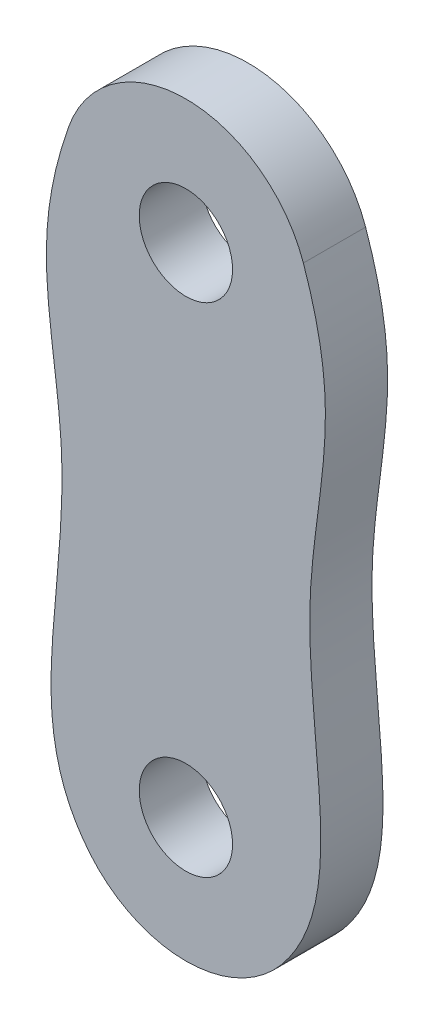
ISO-10303-21;
HEADER;
FILE_DESCRIPTION(('STEP AP214'),'2;1');
FILE_NAME('part.step','',(''),(''),'','','');
FILE_SCHEMA(('AUTOMOTIVE_DESIGN { 1 0 10303 214 1 1 1 1 }'));
ENDSEC;
DATA;
#1=APPLICATION_CONTEXT('core data for automotive mechanical design processes');
#2=APPLICATION_PROTOCOL_DEFINITION('international standard','automotive_design',2000,#1);
#3=PRODUCT_CONTEXT('',#1,'mechanical');
#4=PRODUCT('Part','Part','',(#3));
#5=PRODUCT_RELATED_PRODUCT_CATEGORY('part','',(#4));
#6=PRODUCT_DEFINITION_FORMATION('','',#4);
#7=PRODUCT_DEFINITION_CONTEXT('part definition',#1,'design');
#8=PRODUCT_DEFINITION('design','',#6,#7);
#9=PRODUCT_DEFINITION_SHAPE('','',#8);
#10=(LENGTH_UNIT() NAMED_UNIT(*) SI_UNIT(.MILLI.,.METRE.));
#11=(NAMED_UNIT(*) PLANE_ANGLE_UNIT() SI_UNIT($,.RADIAN.));
#12=(NAMED_UNIT(*) SI_UNIT($,.STERADIAN.) SOLID_ANGLE_UNIT());
#13=UNCERTAINTY_MEASURE_WITH_UNIT(LENGTH_MEASURE(1.E-05),#10,'distance_accuracy_value','');
#14=(GEOMETRIC_REPRESENTATION_CONTEXT(3) GLOBAL_UNCERTAINTY_ASSIGNED_CONTEXT((#13)) GLOBAL_UNIT_ASSIGNED_CONTEXT((#10,
#11,#12)) REPRESENTATION_CONTEXT('',''));
#15=CARTESIAN_POINT('',(0.,0.,0.));
#16=DIRECTION('',(0.,0.,1.));
#17=DIRECTION('',(1.,0.,0.));
#18=AXIS2_PLACEMENT_3D('',#15,#16,#17);
#19=CARTESIAN_POINT('',(5.99508975426094,27.4931791223771,3.175));
#20=CARTESIAN_POINT('',(6.69544717492508,25.4872802711713,3.175));
#21=CARTESIAN_POINT('',(7.63606206219812,20.8320013777581,3.175));
#22=CARTESIAN_POINT('',(5.83605341041327,13.1180627429882,3.175));
#23=CARTESIAN_POINT('',(6.97975032831497,4.62348949917081,3.175));
#24=CARTESIAN_POINT('',(7.0327793804503,-1.495925245043,3.175));
#25=CARTESIAN_POINT('',(4.86561148670429,-4.08023588294247,3.175));
#26=B_SPLINE_CURVE_WITH_KNOTS('',3,(#19,#20,#21,#22,#23,#24,#25),.UNSPECIFIED.,.F.,.F.,(4,1,1,1,
4),(0.,0.186998848355747,0.456275955852329,0.716521226621308,1.),.UNSPECIFIED.);
#27=DIRECTION('',(0.,0.,-1.));
#28=VECTOR('',#27,1.);
#29=SURFACE_OF_LINEAR_EXTRUSION('',#26,#28);
#30=CARTESIAN_POINT('',(5.99508975426094,27.4931791223771,0.));
#31=CARTESIAN_POINT('',(6.69544717492508,25.4872802711713,0.));
#32=CARTESIAN_POINT('',(7.63606206219812,20.8320013777581,0.));
#33=CARTESIAN_POINT('',(5.83605341041327,13.1180627429882,0.));
#34=CARTESIAN_POINT('',(6.97975032831497,4.62348949917081,0.));
#35=CARTESIAN_POINT('',(7.0327793804503,-1.495925245043,0.));
#36=CARTESIAN_POINT('',(4.86561148670429,-4.08023588294247,0.));
#37=B_SPLINE_CURVE_WITH_KNOTS('',3,(#30,#31,#32,#33,#34,#35,#36),.UNSPECIFIED.,.F.,.F.,(4,1,1,1,
4),(0.,0.186998848355747,0.456275955852329,0.716521226621308,1.),.UNSPECIFIED.);
#38=CARTESIAN_POINT('',(5.99508975426094,27.4931791223771,0.));
#39=VERTEX_POINT('',#38);
#40=CARTESIAN_POINT('',(4.86561148670429,-4.08023588294247,0.));
#41=VERTEX_POINT('',#40);
#42=EDGE_CURVE('E116',#39,#41,#37,.T.);
#43=ORIENTED_EDGE('',*,*,#42,.F.);
#44=DIRECTION('',(0.,0.,-1.));
#45=VECTOR('',#44,1.);
#46=CARTESIAN_POINT('',(5.99508975426094,27.4931791223771,3.175));
#47=LINE('',#46,#45);
#48=CARTESIAN_POINT('',(5.99508975426094,27.4931791223771,3.175));
#49=VERTEX_POINT('',#48);
#50=EDGE_CURVE('E11',#49,#39,#47,.T.);
#51=ORIENTED_EDGE('',*,*,#50,.F.);
#52=CARTESIAN_POINT('',(4.86561148670429,-4.08023588294247,3.175));
#53=VERTEX_POINT('',#52);
#54=EDGE_CURVE('E85',#49,#53,#26,.T.);
#55=ORIENTED_EDGE('',*,*,#54,.T.);
#56=DIRECTION('',(0.,0.,-1.));
#57=VECTOR('',#56,1.);
#58=CARTESIAN_POINT('',(4.86561148670429,-4.08023588294247,3.175));
#59=LINE('',#58,#57);
#60=EDGE_CURVE('E73',#53,#41,#59,.T.);
#61=ORIENTED_EDGE('',*,*,#60,.T.);
#62=EDGE_LOOP('',(#43,#51,#55,#61));
#63=FACE_BOUND('',#62,.T.);
#64=ADVANCED_FACE('F33',(#63),#29,.T.);
#65=CARTESIAN_POINT('',(0.,25.4,3.175));
#66=DIRECTION('',(0.,0.,-1.));
#67=DIRECTION('',(-1.,0.,0.));
#68=AXIS2_PLACEMENT_3D('',#65,#66,#67);
#69=CYLINDRICAL_SURFACE('',#68,6.35);
#70=CARTESIAN_POINT('',(0.,25.4,0.));
#71=DIRECTION('',(0.,0.,1.));
#72=DIRECTION('',(1.,0.,0.));
#73=AXIS2_PLACEMENT_3D('',#70,#71,#72);
#74=CIRCLE('',#73,6.35);
#75=CARTESIAN_POINT('',(-5.99508975426094,27.4931791223771,0.));
#76=VERTEX_POINT('',#75);
#77=EDGE_CURVE('E90',#39,#76,#74,.T.);
#78=ORIENTED_EDGE('',*,*,#77,.T.);
#79=DIRECTION('',(0.,0.,-1.));
#80=VECTOR('',#79,1.);
#81=CARTESIAN_POINT('',(-5.99508975426094,27.4931791223771,3.175));
#82=LINE('',#81,#80);
#83=CARTESIAN_POINT('',(-5.99508975426094,27.4931791223771,3.175));
#84=VERTEX_POINT('',#83);
#85=EDGE_CURVE('E42',#84,#76,#82,.T.);
#86=ORIENTED_EDGE('',*,*,#85,.F.);
#87=CARTESIAN_POINT('',(0.,25.4,3.175));
#88=DIRECTION('',(0.,0.,1.));
#89=DIRECTION('',(1.,0.,0.));
#90=AXIS2_PLACEMENT_3D('',#87,#88,#89);
#91=CIRCLE('',#90,6.35);
#92=EDGE_CURVE('E79',#49,#84,#91,.T.);
#93=ORIENTED_EDGE('',*,*,#92,.F.);
#94=ORIENTED_EDGE('',*,*,#50,.T.);
#95=EDGE_LOOP('',(#78,#86,#93,#94));
#96=FACE_BOUND('',#95,.T.);
#97=ADVANCED_FACE('F88',(#96),#69,.T.);
#98=CARTESIAN_POINT('',(-5.99508975426094,27.4931791223771,3.175));
#99=CARTESIAN_POINT('',(-6.69544717492508,25.4872802711713,3.175));
#100=CARTESIAN_POINT('',(-7.63606206219812,20.8320013777581,3.175));
#101=CARTESIAN_POINT('',(-5.83605341041327,13.1180627429882,3.175));
#102=CARTESIAN_POINT('',(-6.97975032831497,4.62348949917081,3.175));
#103=CARTESIAN_POINT('',(-7.0327793804503,-1.495925245043,3.175));
#104=CARTESIAN_POINT('',(-4.86561148670429,-4.08023588294247,3.175));
#105=B_SPLINE_CURVE_WITH_KNOTS('',3,(#98,#99,#100,#101,#102,#103,#104),.UNSPECIFIED.,.F.,.F.,(4,
1,1,1,4),(0.,0.186998848355747,0.456275955852329,0.716521226621308,1.),.UNSPECIFIED.);
#106=DIRECTION('',(0.,0.,-1.));
#107=VECTOR('',#106,1.);
#108=SURFACE_OF_LINEAR_EXTRUSION('',#105,#107);
#109=CARTESIAN_POINT('',(-5.99508975426094,27.4931791223771,0.));
#110=CARTESIAN_POINT('',(-6.69544717492508,25.4872802711713,0.));
#111=CARTESIAN_POINT('',(-7.63606206219812,20.8320013777581,0.));
#112=CARTESIAN_POINT('',(-5.83605341041327,13.1180627429882,0.));
#113=CARTESIAN_POINT('',(-6.97975032831497,4.62348949917081,0.));
#114=CARTESIAN_POINT('',(-7.0327793804503,-1.495925245043,0.));
#115=CARTESIAN_POINT('',(-4.86561148670429,-4.08023588294247,0.));
#116=B_SPLINE_CURVE_WITH_KNOTS('',3,(#109,#110,#111,#112,#113,#114,#115),.UNSPECIFIED.,.F.,.F.,
(4,1,1,1,4),(0.,0.186998848355747,0.456275955852329,0.716521226621308,1.),.UNSPECIFIED.);
#117=CARTESIAN_POINT('',(-4.86561148670429,-4.08023588294247,0.));
#118=VERTEX_POINT('',#117);
#119=EDGE_CURVE('E66',#76,#118,#116,.T.);
#120=ORIENTED_EDGE('',*,*,#119,.T.);
#121=DIRECTION('',(0.,0.,-1.));
#122=VECTOR('',#121,1.);
#123=CARTESIAN_POINT('',(-4.86561148670429,-4.08023588294247,3.175));
#124=LINE('',#123,#122);
#125=CARTESIAN_POINT('',(-4.86561148670429,-4.08023588294247,3.175));
#126=VERTEX_POINT('',#125);
#127=EDGE_CURVE('E91',#126,#118,#124,.T.);
#128=ORIENTED_EDGE('',*,*,#127,.F.);
#129=EDGE_CURVE('E84',#84,#126,#105,.T.);
#130=ORIENTED_EDGE('',*,*,#129,.F.);
#131=ORIENTED_EDGE('',*,*,#85,.T.);
#132=EDGE_LOOP('',(#120,#128,#130,#131));
#133=FACE_BOUND('',#132,.T.);
#134=ADVANCED_FACE('F92',(#133),#108,.F.);
#135=CARTESIAN_POINT('',(0.,25.4,3.175));
#136=DIRECTION('',(0.,0.,-1.));
#137=DIRECTION('',(-1.,0.,0.));
#138=AXIS2_PLACEMENT_3D('',#135,#136,#137);
#139=CYLINDRICAL_SURFACE('',#138,2.38125);
#140=CARTESIAN_POINT('',(0.,25.4,3.175));
#141=DIRECTION('',(0.,0.,1.));
#142=DIRECTION('',(1.,0.,0.));
#143=AXIS2_PLACEMENT_3D('',#140,#141,#142);
#144=CIRCLE('',#143,2.38125);
#145=CARTESIAN_POINT('',(2.38125,25.4,3.175));
#146=VERTEX_POINT('',#145);
#147=EDGE_CURVE('E94',#146,#146,#144,.T.);
#148=ORIENTED_EDGE('',*,*,#147,.T.);
#149=EDGE_LOOP('',(#148));
#150=FACE_BOUND('',#149,.T.);
#151=CARTESIAN_POINT('',(0.,25.4,0.));
#152=DIRECTION('',(0.,0.,1.));
#153=DIRECTION('',(1.,0.,0.));
#154=AXIS2_PLACEMENT_3D('',#151,#152,#153);
#155=CIRCLE('',#154,2.38125);
#156=CARTESIAN_POINT('',(2.38125,25.4,0.));
#157=VERTEX_POINT('',#156);
#158=EDGE_CURVE('E137',#157,#157,#155,.T.);
#159=ORIENTED_EDGE('',*,*,#158,.F.);
#160=EDGE_LOOP('',(#159));
#161=FACE_BOUND('',#160,.T.);
#162=ADVANCED_FACE('F106',(#150,#161),#139,.F.);
#163=CARTESIAN_POINT('',(0.,0.,3.175));
#164=DIRECTION('',(0.,0.,-1.));
#165=DIRECTION('',(-1.,0.,0.));
#166=AXIS2_PLACEMENT_3D('',#163,#164,#165);
#167=CYLINDRICAL_SURFACE('',#166,6.35);
#168=CARTESIAN_POINT('',(0.,0.,0.));
#169=DIRECTION('',(0.,0.,1.));
#170=DIRECTION('',(1.,0.,0.));
#171=AXIS2_PLACEMENT_3D('',#168,#169,#170);
#172=CIRCLE('',#171,6.35);
#173=EDGE_CURVE('E132',#118,#41,#172,.T.);
#174=ORIENTED_EDGE('',*,*,#173,.T.);
#175=ORIENTED_EDGE('',*,*,#60,.F.);
#176=CARTESIAN_POINT('',(0.,0.,3.175));
#177=DIRECTION('',(0.,0.,1.));
#178=DIRECTION('',(1.,0.,0.));
#179=AXIS2_PLACEMENT_3D('',#176,#177,#178);
#180=CIRCLE('',#179,6.35);
#181=EDGE_CURVE('E50',#126,#53,#180,.T.);
#182=ORIENTED_EDGE('',*,*,#181,.F.);
#183=ORIENTED_EDGE('',*,*,#127,.T.);
#184=EDGE_LOOP('',(#174,#175,#182,#183));
#185=FACE_BOUND('',#184,.T.);
#186=ADVANCED_FACE('F107',(#185),#167,.T.);
#187=CARTESIAN_POINT('',(0.,0.,3.175));
#188=DIRECTION('',(0.,0.,-1.));
#189=DIRECTION('',(-1.,0.,0.));
#190=AXIS2_PLACEMENT_3D('',#187,#188,#189);
#191=CYLINDRICAL_SURFACE('',#190,2.38125);
#192=CARTESIAN_POINT('',(0.,0.,3.175));
#193=DIRECTION('',(0.,0.,1.));
#194=DIRECTION('',(1.,0.,0.));
#195=AXIS2_PLACEMENT_3D('',#192,#193,#194);
#196=CIRCLE('',#195,2.38125);
#197=CARTESIAN_POINT('',(2.38125,0.,3.175));
#198=VERTEX_POINT('',#197);
#199=EDGE_CURVE('E124',#198,#198,#196,.T.);
#200=ORIENTED_EDGE('',*,*,#199,.T.);
#201=EDGE_LOOP('',(#200));
#202=FACE_BOUND('',#201,.T.);
#203=CARTESIAN_POINT('',(0.,0.,0.));
#204=DIRECTION('',(0.,0.,1.));
#205=DIRECTION('',(1.,0.,0.));
#206=AXIS2_PLACEMENT_3D('',#203,#204,#205);
#207=CIRCLE('',#206,2.38125);
#208=CARTESIAN_POINT('',(2.38125,0.,0.));
#209=VERTEX_POINT('',#208);
#210=EDGE_CURVE('E140',#209,#209,#207,.T.);
#211=ORIENTED_EDGE('',*,*,#210,.F.);
#212=EDGE_LOOP('',(#211));
#213=FACE_BOUND('',#212,.T.);
#214=ADVANCED_FACE('F153',(#202,#213),#191,.F.);
#215=CARTESIAN_POINT('',(0.,0.,3.175));
#216=DIRECTION('',(0.,0.,1.));
#217=DIRECTION('',(1.,0.,0.));
#218=AXIS2_PLACEMENT_3D('',#215,#216,#217);
#219=PLANE('',#218);
#220=ORIENTED_EDGE('',*,*,#54,.F.);
#221=ORIENTED_EDGE('',*,*,#92,.T.);
#222=ORIENTED_EDGE('',*,*,#129,.T.);
#223=ORIENTED_EDGE('',*,*,#181,.T.);
#224=EDGE_LOOP('',(#220,#221,#222,#223));
#225=FACE_BOUND('',#224,.T.);
#226=ORIENTED_EDGE('',*,*,#147,.F.);
#227=EDGE_LOOP('',(#226));
#228=FACE_BOUND('',#227,.T.);
#229=ORIENTED_EDGE('',*,*,#199,.F.);
#230=EDGE_LOOP('',(#229));
#231=FACE_BOUND('',#230,.T.);
#232=ADVANCED_FACE('F81',(#225,#228,#231),#219,.T.);
#233=CARTESIAN_POINT('',(0.,0.,0.));
#234=DIRECTION('',(0.,0.,1.));
#235=DIRECTION('',(1.,0.,0.));
#236=AXIS2_PLACEMENT_3D('',#233,#234,#235);
#237=PLANE('',#236);
#238=ORIENTED_EDGE('',*,*,#42,.T.);
#239=ORIENTED_EDGE('',*,*,#173,.F.);
#240=ORIENTED_EDGE('',*,*,#119,.F.);
#241=ORIENTED_EDGE('',*,*,#77,.F.);
#242=EDGE_LOOP('',(#238,#239,#240,#241));
#243=FACE_BOUND('',#242,.T.);
#244=ORIENTED_EDGE('',*,*,#158,.T.);
#245=EDGE_LOOP('',(#244));
#246=FACE_BOUND('',#245,.T.);
#247=ORIENTED_EDGE('',*,*,#210,.T.);
#248=EDGE_LOOP('',(#247));
#249=FACE_BOUND('',#248,.T.);
#250=ADVANCED_FACE('F145',(#243,#246,#249),#237,.F.);
#251=CLOSED_SHELL('',(#64,#97,#134,#162,#186,#214,#232,#250));
#252=MANIFOLD_SOLID_BREP('B2',#251);
#253=ADVANCED_BREP_SHAPE_REPRESENTATION('',(#18,#252),#14);
#254=SHAPE_DEFINITION_REPRESENTATION(#9,#253);
ENDSEC;
END-ISO-10303-21;
